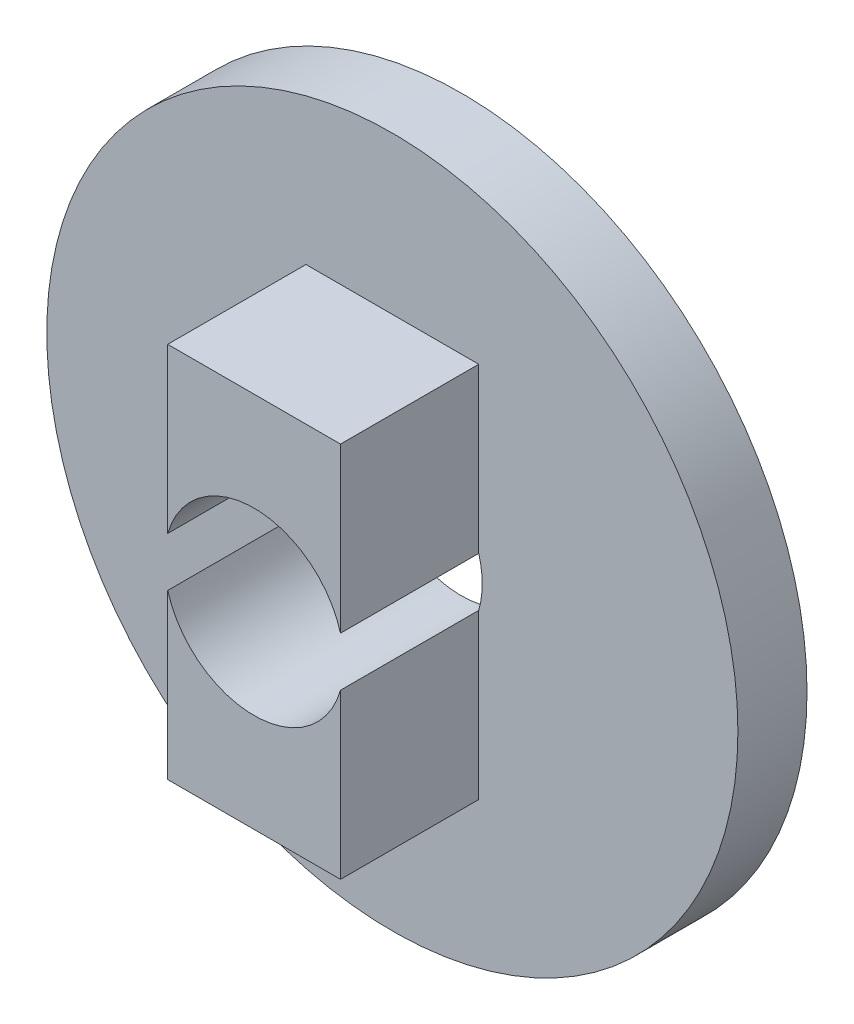
ISO-10303-21;
HEADER;
FILE_DESCRIPTION(('STEP AP214'),'2;1');
FILE_NAME('part.step','',(''),(''),'','','');
FILE_SCHEMA(('AUTOMOTIVE_DESIGN { 1 0 10303 214 1 1 1 1 }'));
ENDSEC;
DATA;
#1=APPLICATION_CONTEXT('core data for automotive mechanical design processes');
#2=APPLICATION_PROTOCOL_DEFINITION('international standard','automotive_design',2000,#1);
#3=PRODUCT_CONTEXT('',#1,'mechanical');
#4=PRODUCT('Part','Part','',(#3));
#5=PRODUCT_RELATED_PRODUCT_CATEGORY('part','',(#4));
#6=PRODUCT_DEFINITION_FORMATION('','',#4);
#7=PRODUCT_DEFINITION_CONTEXT('part definition',#1,'design');
#8=PRODUCT_DEFINITION('design','',#6,#7);
#9=PRODUCT_DEFINITION_SHAPE('','',#8);
#10=(LENGTH_UNIT() NAMED_UNIT(*) SI_UNIT(.MILLI.,.METRE.));
#11=(NAMED_UNIT(*) PLANE_ANGLE_UNIT() SI_UNIT($,.RADIAN.));
#12=(NAMED_UNIT(*) SI_UNIT($,.STERADIAN.) SOLID_ANGLE_UNIT());
#13=UNCERTAINTY_MEASURE_WITH_UNIT(LENGTH_MEASURE(1.E-05),#10,'distance_accuracy_value','');
#14=(GEOMETRIC_REPRESENTATION_CONTEXT(3) GLOBAL_UNCERTAINTY_ASSIGNED_CONTEXT((#13)) GLOBAL_UNIT_ASSIGNED_CONTEXT((#10,
#11,#12)) REPRESENTATION_CONTEXT('',''));
#15=CARTESIAN_POINT('',(0.,0.,0.));
#16=DIRECTION('',(0.,0.,1.));
#17=DIRECTION('',(1.,0.,0.));
#18=AXIS2_PLACEMENT_3D('',#15,#16,#17);
#19=CARTESIAN_POINT('',(1.25,0.,3.));
#20=DIRECTION('',(-1.,0.,0.));
#21=DIRECTION('',(0.,0.,1.));
#22=AXIS2_PLACEMENT_3D('',#19,#20,#21);
#23=PLANE('',#22);
#24=DIRECTION('',(0.,1.,0.));
#25=VECTOR('',#24,1.);
#26=CARTESIAN_POINT('',(1.25,0.,1.));
#27=LINE('',#26,#25);
#28=CARTESIAN_POINT('',(1.25,-2.72717802865893,1.));
#29=VERTEX_POINT('',#28);
#30=CARTESIAN_POINT('',(1.25,-0.357071421427138,1.));
#31=VERTEX_POINT('',#30);
#32=EDGE_CURVE('E59',#29,#31,#27,.T.);
#33=ORIENTED_EDGE('',*,*,#32,.T.);
#34=DIRECTION('',(0.,0.,1.));
#35=VECTOR('',#34,1.);
#36=CARTESIAN_POINT('',(1.25,-0.357071421427138,3.));
#37=LINE('',#36,#35);
#38=CARTESIAN_POINT('',(1.25,-0.357071421427139,3.));
#39=VERTEX_POINT('',#38);
#40=EDGE_CURVE('E141',#31,#39,#37,.T.);
#41=ORIENTED_EDGE('',*,*,#40,.T.);
#42=DIRECTION('',(0.,1.,0.));
#43=VECTOR('',#42,1.);
#44=CARTESIAN_POINT('',(1.25,0.,3.));
#45=LINE('',#44,#43);
#46=CARTESIAN_POINT('',(1.25,-2.72717802865893,3.));
#47=VERTEX_POINT('',#46);
#48=EDGE_CURVE('E122',#47,#39,#45,.T.);
#49=ORIENTED_EDGE('',*,*,#48,.F.);
#50=DIRECTION('',(0.,0.,-1.));
#51=VECTOR('',#50,1.);
#52=CARTESIAN_POINT('',(1.25,-2.72717802865893,3.));
#53=LINE('',#52,#51);
#54=EDGE_CURVE('E155',#47,#29,#53,.T.);
#55=ORIENTED_EDGE('',*,*,#54,.T.);
#56=EDGE_LOOP('',(#33,#41,#49,#55));
#57=FACE_BOUND('',#56,.T.);
#58=ADVANCED_FACE('F34',(#57),#23,.F.);
#59=CARTESIAN_POINT('',(-1.25,0.,3.));
#60=DIRECTION('',(-1.,0.,0.));
#61=DIRECTION('',(0.,0.,1.));
#62=AXIS2_PLACEMENT_3D('',#59,#60,#61);
#63=PLANE('',#62);
#64=DIRECTION('',(0.,0.,1.));
#65=VECTOR('',#64,1.);
#66=CARTESIAN_POINT('',(-1.25,-0.357071421427138,3.));
#67=LINE('',#66,#65);
#68=CARTESIAN_POINT('',(-1.25,-0.357071421427138,1.));
#69=VERTEX_POINT('',#68);
#70=CARTESIAN_POINT('',(-1.25,-0.357071421427139,3.));
#71=VERTEX_POINT('',#70);
#72=EDGE_CURVE('E51',#69,#71,#67,.T.);
#73=ORIENTED_EDGE('',*,*,#72,.F.);
#74=DIRECTION('',(0.,1.,0.));
#75=VECTOR('',#74,1.);
#76=CARTESIAN_POINT('',(-1.25,0.,1.));
#77=LINE('',#76,#75);
#78=CARTESIAN_POINT('',(-1.25,-2.72717802865893,1.));
#79=VERTEX_POINT('',#78);
#80=EDGE_CURVE('E128',#79,#69,#77,.T.);
#81=ORIENTED_EDGE('',*,*,#80,.F.);
#82=DIRECTION('',(0.,0.,-1.));
#83=VECTOR('',#82,1.);
#84=CARTESIAN_POINT('',(-1.25,-2.72717802865893,3.));
#85=LINE('',#84,#83);
#86=CARTESIAN_POINT('',(-1.25,-2.72717802865893,3.));
#87=VERTEX_POINT('',#86);
#88=EDGE_CURVE('E136',#87,#79,#85,.T.);
#89=ORIENTED_EDGE('',*,*,#88,.F.);
#90=DIRECTION('',(0.,1.,0.));
#91=VECTOR('',#90,1.);
#92=CARTESIAN_POINT('',(-1.25,0.,3.));
#93=LINE('',#92,#91);
#94=EDGE_CURVE('E133',#87,#71,#93,.T.);
#95=ORIENTED_EDGE('',*,*,#94,.T.);
#96=EDGE_LOOP('',(#73,#81,#89,#95));
#97=FACE_BOUND('',#96,.T.);
#98=ADVANCED_FACE('F178',(#97),#63,.T.);
#99=CARTESIAN_POINT('',(0.,0.,3.));
#100=DIRECTION('',(0.,0.,1.));
#101=DIRECTION('',(1.,0.,0.));
#102=AXIS2_PLACEMENT_3D('',#99,#100,#101);
#103=PLANE('',#102);
#104=CARTESIAN_POINT('',(0.,0.,3.));
#105=DIRECTION('',(0.,0.,1.));
#106=DIRECTION('',(1.,0.,0.));
#107=AXIS2_PLACEMENT_3D('',#104,#105,#106);
#108=CIRCLE('',#107,1.3);
#109=CARTESIAN_POINT('',(1.25,0.357071421427139,3.));
#110=VERTEX_POINT('',#109);
#111=CARTESIAN_POINT('',(-1.25,0.357071421427139,3.));
#112=VERTEX_POINT('',#111);
#113=EDGE_CURVE('E45',#110,#112,#108,.T.);
#114=ORIENTED_EDGE('',*,*,#113,.F.);
#115=CARTESIAN_POINT('',(1.25,2.72717802865893,3.));
#116=VERTEX_POINT('',#115);
#117=EDGE_CURVE('E114',#110,#116,#45,.T.);
#118=ORIENTED_EDGE('',*,*,#117,.T.);
#119=DIRECTION('',(1.,0.,0.));
#120=VECTOR('',#119,1.);
#121=CARTESIAN_POINT('',(0.,2.72717802865893,3.));
#122=LINE('',#121,#120);
#123=CARTESIAN_POINT('',(-1.25,2.72717802865893,3.));
#124=VERTEX_POINT('',#123);
#125=EDGE_CURVE('E126',#124,#116,#122,.T.);
#126=ORIENTED_EDGE('',*,*,#125,.F.);
#127=EDGE_CURVE('E116',#112,#124,#93,.T.);
#128=ORIENTED_EDGE('',*,*,#127,.F.);
#129=EDGE_LOOP('',(#114,#118,#126,#128));
#130=FACE_BOUND('',#129,.T.);
#131=ADVANCED_FACE('F112',(#130),#103,.T.);
#132=CARTESIAN_POINT('',(0.,0.,1.));
#133=DIRECTION('',(0.,0.,1.));
#134=DIRECTION('',(1.,0.,0.));
#135=AXIS2_PLACEMENT_3D('',#132,#133,#134);
#136=PLANE('',#135);
#137=CARTESIAN_POINT('',(0.,0.,1.));
#138=DIRECTION('',(0.,0.,1.));
#139=DIRECTION('',(1.,0.,0.));
#140=AXIS2_PLACEMENT_3D('',#137,#138,#139);
#141=CIRCLE('',#140,1.3);
#142=CARTESIAN_POINT('',(-1.25,0.357071421427138,1.));
#143=VERTEX_POINT('',#142);
#144=EDGE_CURVE('E210',#143,#69,#141,.T.);
#145=ORIENTED_EDGE('',*,*,#144,.F.);
#146=CARTESIAN_POINT('',(-1.25,2.72717802865893,1.));
#147=VERTEX_POINT('',#146);
#148=EDGE_CURVE('E146',#143,#147,#77,.T.);
#149=ORIENTED_EDGE('',*,*,#148,.T.);
#150=DIRECTION('',(1.,0.,0.));
#151=VECTOR('',#150,1.);
#152=CARTESIAN_POINT('',(0.,2.72717802865893,1.));
#153=LINE('',#152,#151);
#154=CARTESIAN_POINT('',(1.25,2.72717802865893,1.));
#155=VERTEX_POINT('',#154);
#156=EDGE_CURVE('E143',#147,#155,#153,.T.);
#157=ORIENTED_EDGE('',*,*,#156,.T.);
#158=CARTESIAN_POINT('',(1.25,0.357071421427138,1.));
#159=VERTEX_POINT('',#158);
#160=EDGE_CURVE('E140',#159,#155,#27,.T.);
#161=ORIENTED_EDGE('',*,*,#160,.F.);
#162=EDGE_CURVE('E104',#31,#159,#141,.T.);
#163=ORIENTED_EDGE('',*,*,#162,.F.);
#164=ORIENTED_EDGE('',*,*,#32,.F.);
#165=DIRECTION('',(1.,0.,0.));
#166=VECTOR('',#165,1.);
#167=CARTESIAN_POINT('',(0.,-2.72717802865893,1.));
#168=LINE('',#167,#166);
#169=EDGE_CURVE('E137',#79,#29,#168,.T.);
#170=ORIENTED_EDGE('',*,*,#169,.F.);
#171=ORIENTED_EDGE('',*,*,#80,.T.);
#172=EDGE_LOOP('',(#145,#149,#157,#161,#163,#164,#170,#171));
#173=FACE_BOUND('',#172,.T.);
#174=CARTESIAN_POINT('',(0.,0.,1.));
#175=DIRECTION('',(0.,0.,1.));
#176=DIRECTION('',(1.,0.,0.));
#177=AXIS2_PLACEMENT_3D('',#174,#175,#176);
#178=CIRCLE('',#177,5.);
#179=CARTESIAN_POINT('',(5.,0.,1.));
#180=VERTEX_POINT('',#179);
#181=EDGE_CURVE('E43',#180,#180,#178,.T.);
#182=ORIENTED_EDGE('',*,*,#181,.T.);
#183=EDGE_LOOP('',(#182));
#184=FACE_BOUND('',#183,.T.);
#185=ADVANCED_FACE('F173',(#173,#184),#136,.T.);
#186=CARTESIAN_POINT('',(0.,0.,1.));
#187=DIRECTION('',(0.,0.,-1.));
#188=DIRECTION('',(-1.,0.,0.));
#189=AXIS2_PLACEMENT_3D('',#186,#187,#188);
#190=CYLINDRICAL_SURFACE('',#189,5.);
#191=ORIENTED_EDGE('',*,*,#181,.F.);
#192=EDGE_LOOP('',(#191));
#193=FACE_BOUND('',#192,.T.);
#194=CARTESIAN_POINT('',(0.,0.,0.));
#195=DIRECTION('',(0.,0.,1.));
#196=DIRECTION('',(1.,0.,0.));
#197=AXIS2_PLACEMENT_3D('',#194,#195,#196);
#198=CIRCLE('',#197,5.);
#199=CARTESIAN_POINT('',(5.,0.,0.));
#200=VERTEX_POINT('',#199);
#201=EDGE_CURVE('E38',#200,#200,#198,.T.);
#202=ORIENTED_EDGE('',*,*,#201,.T.);
#203=EDGE_LOOP('',(#202));
#204=FACE_BOUND('',#203,.T.);
#205=ADVANCED_FACE('F36',(#193,#204),#190,.T.);
#206=CARTESIAN_POINT('',(0.,0.,0.));
#207=DIRECTION('',(0.,0.,1.));
#208=DIRECTION('',(1.,0.,0.));
#209=AXIS2_PLACEMENT_3D('',#206,#207,#208);
#210=PLANE('',#209);
#211=CARTESIAN_POINT('',(0.,0.,0.));
#212=DIRECTION('',(0.,0.,1.));
#213=DIRECTION('',(1.,0.,0.));
#214=AXIS2_PLACEMENT_3D('',#211,#212,#213);
#215=CIRCLE('',#214,1.3);
#216=CARTESIAN_POINT('',(1.3,0.,0.));
#217=VERTEX_POINT('',#216);
#218=EDGE_CURVE('E108',#217,#217,#215,.T.);
#219=ORIENTED_EDGE('',*,*,#218,.T.);
#220=EDGE_LOOP('',(#219));
#221=FACE_BOUND('',#220,.T.);
#222=ORIENTED_EDGE('',*,*,#201,.F.);
#223=EDGE_LOOP('',(#222));
#224=FACE_BOUND('',#223,.T.);
#225=ADVANCED_FACE('F163',(#221,#224),#210,.F.);
#226=CARTESIAN_POINT('',(0.,-2.72717802865893,3.));
#227=DIRECTION('',(0.,1.,0.));
#228=DIRECTION('',(0.,0.,1.));
#229=AXIS2_PLACEMENT_3D('',#226,#227,#228);
#230=PLANE('',#229);
#231=ORIENTED_EDGE('',*,*,#169,.T.);
#232=ORIENTED_EDGE('',*,*,#54,.F.);
#233=DIRECTION('',(1.,0.,0.));
#234=VECTOR('',#233,1.);
#235=CARTESIAN_POINT('',(0.,-2.72717802865893,3.));
#236=LINE('',#235,#234);
#237=EDGE_CURVE('E123',#87,#47,#236,.T.);
#238=ORIENTED_EDGE('',*,*,#237,.F.);
#239=ORIENTED_EDGE('',*,*,#88,.T.);
#240=EDGE_LOOP('',(#231,#232,#238,#239));
#241=FACE_BOUND('',#240,.T.);
#242=ADVANCED_FACE('F165',(#241),#230,.F.);
#243=ORIENTED_EDGE('',*,*,#117,.F.);
#244=DIRECTION('',(0.,0.,1.));
#245=VECTOR('',#244,1.);
#246=CARTESIAN_POINT('',(1.25,0.357071421427138,3.));
#247=LINE('',#246,#245);
#248=EDGE_CURVE('E100',#110,#159,#247,.F.);
#249=ORIENTED_EDGE('',*,*,#248,.T.);
#250=ORIENTED_EDGE('',*,*,#160,.T.);
#251=DIRECTION('',(0.,0.,-1.));
#252=VECTOR('',#251,1.);
#253=CARTESIAN_POINT('',(1.25,2.72717802865893,3.));
#254=LINE('',#253,#252);
#255=EDGE_CURVE('E120',#116,#155,#254,.T.);
#256=ORIENTED_EDGE('',*,*,#255,.F.);
#257=EDGE_LOOP('',(#243,#249,#250,#256));
#258=FACE_BOUND('',#257,.T.);
#259=ADVANCED_FACE('F118',(#258),#23,.F.);
#260=CARTESIAN_POINT('',(0.,2.72717802865893,3.));
#261=DIRECTION('',(0.,1.,0.));
#262=DIRECTION('',(0.,0.,1.));
#263=AXIS2_PLACEMENT_3D('',#260,#261,#262);
#264=PLANE('',#263);
#265=ORIENTED_EDGE('',*,*,#156,.F.);
#266=DIRECTION('',(0.,0.,-1.));
#267=VECTOR('',#266,1.);
#268=CARTESIAN_POINT('',(-1.25,2.72717802865893,3.));
#269=LINE('',#268,#267);
#270=EDGE_CURVE('E151',#124,#147,#269,.T.);
#271=ORIENTED_EDGE('',*,*,#270,.F.);
#272=ORIENTED_EDGE('',*,*,#125,.T.);
#273=ORIENTED_EDGE('',*,*,#255,.T.);
#274=EDGE_LOOP('',(#265,#271,#272,#273));
#275=FACE_BOUND('',#274,.T.);
#276=ADVANCED_FACE('F189',(#275),#264,.T.);
#277=DIRECTION('',(0.,0.,1.));
#278=VECTOR('',#277,1.);
#279=CARTESIAN_POINT('',(-1.25,0.357071421427138,3.));
#280=LINE('',#279,#278);
#281=EDGE_CURVE('E117',#112,#143,#280,.F.);
#282=ORIENTED_EDGE('',*,*,#281,.F.);
#283=ORIENTED_EDGE('',*,*,#127,.T.);
#284=ORIENTED_EDGE('',*,*,#270,.T.);
#285=ORIENTED_EDGE('',*,*,#148,.F.);
#286=EDGE_LOOP('',(#282,#283,#284,#285));
#287=FACE_BOUND('',#286,.T.);
#288=ADVANCED_FACE('F186',(#287),#63,.T.);
#289=EDGE_CURVE('E11',#71,#39,#108,.T.);
#290=ORIENTED_EDGE('',*,*,#289,.F.);
#291=ORIENTED_EDGE('',*,*,#94,.F.);
#292=ORIENTED_EDGE('',*,*,#237,.T.);
#293=ORIENTED_EDGE('',*,*,#48,.T.);
#294=EDGE_LOOP('',(#290,#291,#292,#293));
#295=FACE_BOUND('',#294,.T.);
#296=ADVANCED_FACE('F197',(#295),#103,.T.);
#297=CARTESIAN_POINT('',(0.,0.,3.));
#298=DIRECTION('',(0.,0.,1.));
#299=DIRECTION('',(1.,0.,0.));
#300=AXIS2_PLACEMENT_3D('',#297,#298,#299);
#301=CYLINDRICAL_SURFACE('',#300,1.3);
#302=ORIENTED_EDGE('',*,*,#218,.F.);
#303=EDGE_LOOP('',(#302));
#304=FACE_BOUND('',#303,.T.);
#305=ORIENTED_EDGE('',*,*,#162,.T.);
#306=ORIENTED_EDGE('',*,*,#248,.F.);
#307=ORIENTED_EDGE('',*,*,#113,.T.);
#308=ORIENTED_EDGE('',*,*,#281,.T.);
#309=ORIENTED_EDGE('',*,*,#144,.T.);
#310=ORIENTED_EDGE('',*,*,#72,.T.);
#311=ORIENTED_EDGE('',*,*,#289,.T.);
#312=ORIENTED_EDGE('',*,*,#40,.F.);
#313=EDGE_LOOP('',(#305,#306,#307,#308,#309,#310,#311,#312));
#314=FACE_BOUND('',#313,.T.);
#315=ADVANCED_FACE('F102',(#304,#314),#301,.F.);
#316=CLOSED_SHELL('',(#58,#98,#131,#185,#205,#225,#242,#259,#276,#288,#296,#315));
#317=MANIFOLD_SOLID_BREP('B2',#316);
#318=ADVANCED_BREP_SHAPE_REPRESENTATION('',(#18,#317),#14);
#319=SHAPE_DEFINITION_REPRESENTATION(#9,#318);
ENDSEC;
END-ISO-10303-21;
